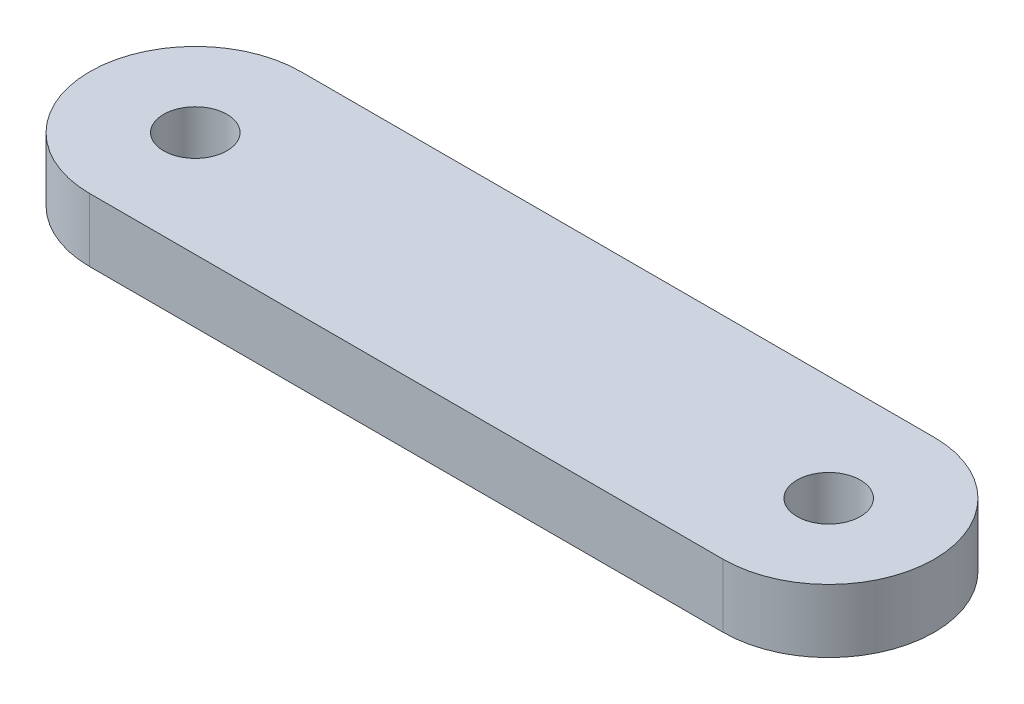
ISO-10303-21;
HEADER;
FILE_DESCRIPTION(('STEP AP214'),'2;1');
FILE_NAME('part.step','',(''),(''),'','','');
FILE_SCHEMA(('AUTOMOTIVE_DESIGN { 1 0 10303 214 1 1 1 1 }'));
ENDSEC;
DATA;
#1=APPLICATION_CONTEXT('core data for automotive mechanical design processes');
#2=APPLICATION_PROTOCOL_DEFINITION('international standard','automotive_design',2000,#1);
#3=PRODUCT_CONTEXT('',#1,'mechanical');
#4=PRODUCT('Part','Part','',(#3));
#5=PRODUCT_RELATED_PRODUCT_CATEGORY('part','',(#4));
#6=PRODUCT_DEFINITION_FORMATION('','',#4);
#7=PRODUCT_DEFINITION_CONTEXT('part definition',#1,'design');
#8=PRODUCT_DEFINITION('design','',#6,#7);
#9=PRODUCT_DEFINITION_SHAPE('','',#8);
#10=(LENGTH_UNIT() NAMED_UNIT(*) SI_UNIT(.MILLI.,.METRE.));
#11=(NAMED_UNIT(*) PLANE_ANGLE_UNIT() SI_UNIT($,.RADIAN.));
#12=(NAMED_UNIT(*) SI_UNIT($,.STERADIAN.) SOLID_ANGLE_UNIT());
#13=UNCERTAINTY_MEASURE_WITH_UNIT(LENGTH_MEASURE(1.E-05),#10,'distance_accuracy_value','');
#14=(GEOMETRIC_REPRESENTATION_CONTEXT(3) GLOBAL_UNCERTAINTY_ASSIGNED_CONTEXT((#13)) GLOBAL_UNIT_ASSIGNED_CONTEXT((#10,
#11,#12)) REPRESENTATION_CONTEXT('',''));
#15=CARTESIAN_POINT('',(0.,0.,0.));
#16=DIRECTION('',(0.,0.,1.));
#17=DIRECTION('',(1.,0.,0.));
#18=AXIS2_PLACEMENT_3D('',#15,#16,#17);
#19=CARTESIAN_POINT('',(-15.,3.,0.));
#20=DIRECTION('',(0.,-1.,0.));
#21=DIRECTION('',(0.,0.,-1.));
#22=AXIS2_PLACEMENT_3D('',#19,#20,#21);
#23=CYLINDRICAL_SURFACE('',#22,5.);
#24=CARTESIAN_POINT('',(-15.,0.,0.));
#25=DIRECTION('',(0.,1.,0.));
#26=DIRECTION('',(0.,0.,1.));
#27=AXIS2_PLACEMENT_3D('',#24,#25,#26);
#28=CIRCLE('',#27,5.);
#29=CARTESIAN_POINT('',(-15.,0.,-5.));
#30=VERTEX_POINT('',#29);
#31=CARTESIAN_POINT('',(-15.,0.,5.));
#32=VERTEX_POINT('',#31);
#33=EDGE_CURVE('E116',#30,#32,#28,.T.);
#34=ORIENTED_EDGE('',*,*,#33,.T.);
#35=DIRECTION('',(0.,-1.,0.));
#36=VECTOR('',#35,1.);
#37=CARTESIAN_POINT('',(-15.,3.,5.));
#38=LINE('',#37,#36);
#39=CARTESIAN_POINT('',(-15.,3.,5.));
#40=VERTEX_POINT('',#39);
#41=EDGE_CURVE('E11',#40,#32,#38,.T.);
#42=ORIENTED_EDGE('',*,*,#41,.F.);
#43=CARTESIAN_POINT('',(-15.,3.,0.));
#44=DIRECTION('',(0.,1.,0.));
#45=DIRECTION('',(0.,0.,1.));
#46=AXIS2_PLACEMENT_3D('',#43,#44,#45);
#47=CIRCLE('',#46,5.);
#48=CARTESIAN_POINT('',(-15.,3.,-5.));
#49=VERTEX_POINT('',#48);
#50=EDGE_CURVE('E99',#49,#40,#47,.T.);
#51=ORIENTED_EDGE('',*,*,#50,.F.);
#52=DIRECTION('',(0.,-1.,0.));
#53=VECTOR('',#52,1.);
#54=CARTESIAN_POINT('',(-15.,3.,-5.));
#55=LINE('',#54,#53);
#56=EDGE_CURVE('E112',#49,#30,#55,.T.);
#57=ORIENTED_EDGE('',*,*,#56,.T.);
#58=EDGE_LOOP('',(#34,#42,#51,#57));
#59=FACE_BOUND('',#58,.T.);
#60=ADVANCED_FACE('F45',(#59),#23,.T.);
#61=CARTESIAN_POINT('',(-15.,3.,5.));
#62=DIRECTION('',(0.,0.,-1.));
#63=DIRECTION('',(-1.,0.,0.));
#64=AXIS2_PLACEMENT_3D('',#61,#62,#63);
#65=PLANE('',#64);
#66=DIRECTION('',(1.,0.,0.));
#67=VECTOR('',#66,1.);
#68=CARTESIAN_POINT('',(-15.,0.,5.));
#69=LINE('',#68,#67);
#70=CARTESIAN_POINT('',(15.,0.,4.99999999999999));
#71=VERTEX_POINT('',#70);
#72=EDGE_CURVE('E104',#32,#71,#69,.T.);
#73=ORIENTED_EDGE('',*,*,#72,.T.);
#74=DIRECTION('',(0.,-1.,0.));
#75=VECTOR('',#74,1.);
#76=CARTESIAN_POINT('',(15.,3.,4.99999999999999));
#77=LINE('',#76,#75);
#78=CARTESIAN_POINT('',(15.,3.,4.99999999999999));
#79=VERTEX_POINT('',#78);
#80=EDGE_CURVE('E55',#79,#71,#77,.T.);
#81=ORIENTED_EDGE('',*,*,#80,.F.);
#82=DIRECTION('',(1.,0.,0.));
#83=VECTOR('',#82,1.);
#84=CARTESIAN_POINT('',(-15.,3.,5.));
#85=LINE('',#84,#83);
#86=EDGE_CURVE('E94',#40,#79,#85,.T.);
#87=ORIENTED_EDGE('',*,*,#86,.F.);
#88=ORIENTED_EDGE('',*,*,#41,.T.);
#89=EDGE_LOOP('',(#73,#81,#87,#88));
#90=FACE_BOUND('',#89,.T.);
#91=ADVANCED_FACE('F103',(#90),#65,.F.);
#92=CARTESIAN_POINT('',(15.,3.,0.));
#93=DIRECTION('',(0.,-1.,0.));
#94=DIRECTION('',(0.,0.,-1.));
#95=AXIS2_PLACEMENT_3D('',#92,#93,#94);
#96=CYLINDRICAL_SURFACE('',#95,5.);
#97=CARTESIAN_POINT('',(15.,0.,0.));
#98=DIRECTION('',(0.,1.,0.));
#99=DIRECTION('',(0.,0.,1.));
#100=AXIS2_PLACEMENT_3D('',#97,#98,#99);
#101=CIRCLE('',#100,5.);
#102=CARTESIAN_POINT('',(15.,0.,-5.00000000000001));
#103=VERTEX_POINT('',#102);
#104=EDGE_CURVE('E81',#71,#103,#101,.T.);
#105=ORIENTED_EDGE('',*,*,#104,.T.);
#106=DIRECTION('',(0.,-1.,0.));
#107=VECTOR('',#106,1.);
#108=CARTESIAN_POINT('',(15.,3.,-5.00000000000001));
#109=LINE('',#108,#107);
#110=CARTESIAN_POINT('',(15.,3.,-5.00000000000001));
#111=VERTEX_POINT('',#110);
#112=EDGE_CURVE('E106',#111,#103,#109,.T.);
#113=ORIENTED_EDGE('',*,*,#112,.F.);
#114=CARTESIAN_POINT('',(15.,3.,0.));
#115=DIRECTION('',(0.,1.,0.));
#116=DIRECTION('',(0.,0.,1.));
#117=AXIS2_PLACEMENT_3D('',#114,#115,#116);
#118=CIRCLE('',#117,5.);
#119=EDGE_CURVE('E97',#79,#111,#118,.T.);
#120=ORIENTED_EDGE('',*,*,#119,.F.);
#121=ORIENTED_EDGE('',*,*,#80,.T.);
#122=EDGE_LOOP('',(#105,#113,#120,#121));
#123=FACE_BOUND('',#122,.T.);
#124=ADVANCED_FACE('F108',(#123),#96,.T.);
#125=CARTESIAN_POINT('',(-15.,3.,-5.));
#126=DIRECTION('',(0.,0.,1.));
#127=DIRECTION('',(1.,0.,0.));
#128=AXIS2_PLACEMENT_3D('',#125,#126,#127);
#129=PLANE('',#128);
#130=DIRECTION('',(-1.,0.,0.));
#131=VECTOR('',#130,1.);
#132=CARTESIAN_POINT('',(-15.,0.,-5.));
#133=LINE('',#132,#131);
#134=EDGE_CURVE('E87',#103,#30,#133,.T.);
#135=ORIENTED_EDGE('',*,*,#134,.T.);
#136=ORIENTED_EDGE('',*,*,#56,.F.);
#137=DIRECTION('',(-1.,0.,0.));
#138=VECTOR('',#137,1.);
#139=CARTESIAN_POINT('',(-15.,3.,-5.));
#140=LINE('',#139,#138);
#141=EDGE_CURVE('E64',#111,#49,#140,.T.);
#142=ORIENTED_EDGE('',*,*,#141,.F.);
#143=ORIENTED_EDGE('',*,*,#112,.T.);
#144=EDGE_LOOP('',(#135,#136,#142,#143));
#145=FACE_BOUND('',#144,.T.);
#146=ADVANCED_FACE('F154',(#145),#129,.F.);
#147=CARTESIAN_POINT('',(-15.,3.,0.));
#148=DIRECTION('',(0.,1.,0.));
#149=DIRECTION('',(0.,0.,1.));
#150=AXIS2_PLACEMENT_3D('',#147,#148,#149);
#151=PLANE('',#150);
#152=CARTESIAN_POINT('',(-15.,3.,0.));
#153=DIRECTION('',(0.,1.,0.));
#154=DIRECTION('',(0.,0.,1.));
#155=AXIS2_PLACEMENT_3D('',#152,#153,#154);
#156=CIRCLE('',#155,1.5);
#157=CARTESIAN_POINT('',(-15.,3.,1.5));
#158=VERTEX_POINT('',#157);
#159=EDGE_CURVE('E132',#158,#158,#156,.T.);
#160=ORIENTED_EDGE('',*,*,#159,.F.);
#161=EDGE_LOOP('',(#160));
#162=FACE_BOUND('',#161,.T.);
#163=CARTESIAN_POINT('',(15.,3.,0.));
#164=DIRECTION('',(0.,1.,0.));
#165=DIRECTION('',(0.,0.,1.));
#166=AXIS2_PLACEMENT_3D('',#163,#164,#165);
#167=CIRCLE('',#166,1.5);
#168=CARTESIAN_POINT('',(15.,3.,1.5));
#169=VERTEX_POINT('',#168);
#170=EDGE_CURVE('E139',#169,#169,#167,.T.);
#171=ORIENTED_EDGE('',*,*,#170,.F.);
#172=EDGE_LOOP('',(#171));
#173=FACE_BOUND('',#172,.T.);
#174=ORIENTED_EDGE('',*,*,#50,.T.);
#175=ORIENTED_EDGE('',*,*,#86,.T.);
#176=ORIENTED_EDGE('',*,*,#119,.T.);
#177=ORIENTED_EDGE('',*,*,#141,.T.);
#178=EDGE_LOOP('',(#174,#175,#176,#177));
#179=FACE_BOUND('',#178,.T.);
#180=ADVANCED_FACE('F95',(#162,#173,#179),#151,.T.);
#181=CARTESIAN_POINT('',(-15.,0.,0.));
#182=DIRECTION('',(0.,1.,0.));
#183=DIRECTION('',(0.,0.,1.));
#184=AXIS2_PLACEMENT_3D('',#181,#182,#183);
#185=PLANE('',#184);
#186=CARTESIAN_POINT('',(-15.,0.,0.));
#187=DIRECTION('',(0.,1.,0.));
#188=DIRECTION('',(0.,0.,1.));
#189=AXIS2_PLACEMENT_3D('',#186,#187,#188);
#190=CIRCLE('',#189,1.5);
#191=CARTESIAN_POINT('',(-15.,0.,1.5));
#192=VERTEX_POINT('',#191);
#193=EDGE_CURVE('E48',#192,#192,#190,.T.);
#194=ORIENTED_EDGE('',*,*,#193,.T.);
#195=EDGE_LOOP('',(#194));
#196=FACE_BOUND('',#195,.T.);
#197=CARTESIAN_POINT('',(15.,0.,0.));
#198=DIRECTION('',(0.,1.,0.));
#199=DIRECTION('',(0.,0.,1.));
#200=AXIS2_PLACEMENT_3D('',#197,#198,#199);
#201=CIRCLE('',#200,1.5);
#202=CARTESIAN_POINT('',(15.,0.,1.5));
#203=VERTEX_POINT('',#202);
#204=EDGE_CURVE('E129',#203,#203,#201,.T.);
#205=ORIENTED_EDGE('',*,*,#204,.T.);
#206=EDGE_LOOP('',(#205));
#207=FACE_BOUND('',#206,.T.);
#208=ORIENTED_EDGE('',*,*,#33,.F.);
#209=ORIENTED_EDGE('',*,*,#134,.F.);
#210=ORIENTED_EDGE('',*,*,#104,.F.);
#211=ORIENTED_EDGE('',*,*,#72,.F.);
#212=EDGE_LOOP('',(#208,#209,#210,#211));
#213=FACE_BOUND('',#212,.T.);
#214=ADVANCED_FACE('F153',(#196,#207,#213),#185,.F.);
#215=CARTESIAN_POINT('',(15.,-7.,0.));
#216=DIRECTION('',(0.,1.,0.));
#217=DIRECTION('',(0.,0.,1.));
#218=AXIS2_PLACEMENT_3D('',#215,#216,#217);
#219=CYLINDRICAL_SURFACE('',#218,1.5);
#220=ORIENTED_EDGE('',*,*,#170,.T.);
#221=EDGE_LOOP('',(#220));
#222=FACE_BOUND('',#221,.T.);
#223=ORIENTED_EDGE('',*,*,#204,.F.);
#224=EDGE_LOOP('',(#223));
#225=FACE_BOUND('',#224,.T.);
#226=ADVANCED_FACE('F149',(#222,#225),#219,.F.);
#227=CARTESIAN_POINT('',(-15.,-7.,0.));
#228=DIRECTION('',(0.,1.,0.));
#229=DIRECTION('',(0.,0.,1.));
#230=AXIS2_PLACEMENT_3D('',#227,#228,#229);
#231=CYLINDRICAL_SURFACE('',#230,1.5);
#232=ORIENTED_EDGE('',*,*,#159,.T.);
#233=EDGE_LOOP('',(#232));
#234=FACE_BOUND('',#233,.T.);
#235=ORIENTED_EDGE('',*,*,#193,.F.);
#236=EDGE_LOOP('',(#235));
#237=FACE_BOUND('',#236,.T.);
#238=ADVANCED_FACE('F203',(#234,#237),#231,.F.);
#239=CLOSED_SHELL('',(#60,#91,#124,#146,#180,#214,#226,#238));
#240=MANIFOLD_SOLID_BREP('B2',#239);
#241=ADVANCED_BREP_SHAPE_REPRESENTATION('',(#18,#240),#14);
#242=SHAPE_DEFINITION_REPRESENTATION(#9,#241);
ENDSEC;
END-ISO-10303-21;
